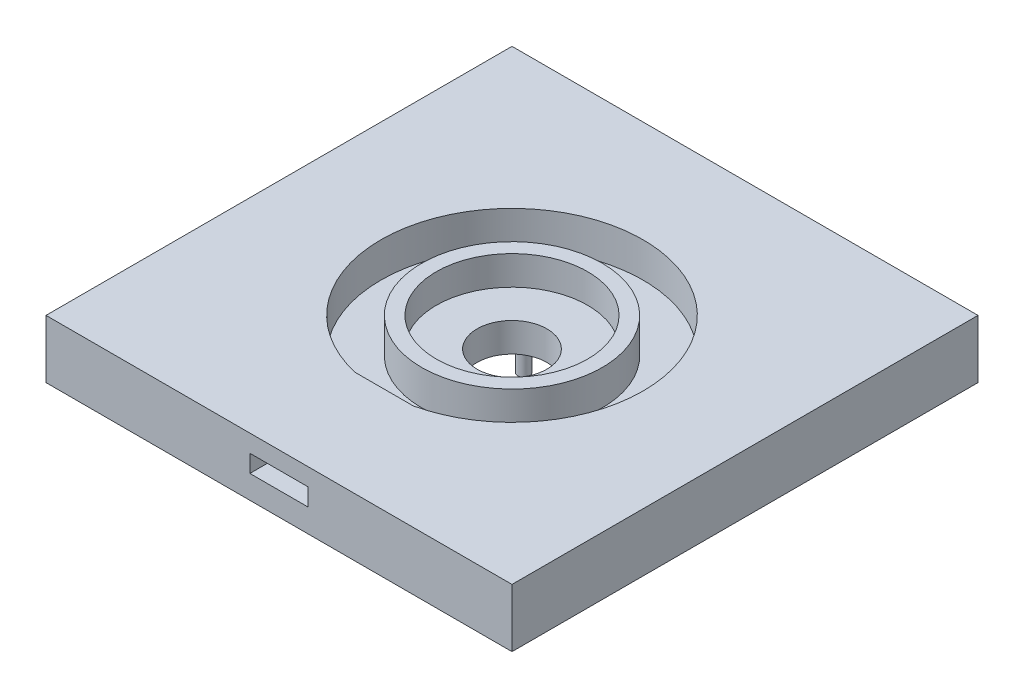
ISO-10303-21;
HEADER;
FILE_DESCRIPTION(('STEP AP214'),'2;1');
FILE_NAME('part.step','',(''),(''),'','','');
FILE_SCHEMA(('AUTOMOTIVE_DESIGN { 1 0 10303 214 1 1 1 1 }'));
ENDSEC;
DATA;
#1=APPLICATION_CONTEXT('core data for automotive mechanical design processes');
#2=APPLICATION_PROTOCOL_DEFINITION('international standard','automotive_design',2000,#1);
#3=PRODUCT_CONTEXT('',#1,'mechanical');
#4=PRODUCT('Part','Part','',(#3));
#5=PRODUCT_RELATED_PRODUCT_CATEGORY('part','',(#4));
#6=PRODUCT_DEFINITION_FORMATION('','',#4);
#7=PRODUCT_DEFINITION_CONTEXT('part definition',#1,'design');
#8=PRODUCT_DEFINITION('design','',#6,#7);
#9=PRODUCT_DEFINITION_SHAPE('','',#8);
#10=(LENGTH_UNIT() NAMED_UNIT(*) SI_UNIT(.MILLI.,.METRE.));
#11=(NAMED_UNIT(*) PLANE_ANGLE_UNIT() SI_UNIT($,.RADIAN.));
#12=(NAMED_UNIT(*) SI_UNIT($,.STERADIAN.) SOLID_ANGLE_UNIT());
#13=UNCERTAINTY_MEASURE_WITH_UNIT(LENGTH_MEASURE(1.E-05),#10,'distance_accuracy_value','');
#14=(GEOMETRIC_REPRESENTATION_CONTEXT(3) GLOBAL_UNCERTAINTY_ASSIGNED_CONTEXT((#13)) GLOBAL_UNIT_ASSIGNED_CONTEXT((#10,
#11,#12)) REPRESENTATION_CONTEXT('',''));
#15=CARTESIAN_POINT('',(0.,0.,0.));
#16=DIRECTION('',(0.,0.,1.));
#17=DIRECTION('',(1.,0.,0.));
#18=AXIS2_PLACEMENT_3D('',#15,#16,#17);
#19=CARTESIAN_POINT('',(6.94458541445559,4.,0.));
#20=DIRECTION('',(-1.,0.,0.));
#21=DIRECTION('',(0.,0.,1.));
#22=AXIS2_PLACEMENT_3D('',#19,#20,#21);
#23=PLANE('',#22);
#24=DIRECTION('',(0.,1.,0.));
#25=VECTOR('',#24,1.);
#26=CARTESIAN_POINT('',(6.94458541445556,4.,35.7587169268071));
#27=LINE('',#26,#25);
#28=CARTESIAN_POINT('',(6.94458541445556,4.,35.7587169268071));
#29=VERTEX_POINT('',#28);
#30=CARTESIAN_POINT('',(6.94458541445556,7.,35.7587169268071));
#31=VERTEX_POINT('',#30);
#32=EDGE_CURVE('E141',#29,#31,#27,.T.);
#33=ORIENTED_EDGE('',*,*,#32,.T.);
#34=DIRECTION('',(0.,0.,-1.));
#35=VECTOR('',#34,1.);
#36=CARTESIAN_POINT('',(6.94458541445559,7.,0.));
#37=LINE('',#36,#35);
#38=CARTESIAN_POINT('',(6.94458541445557,7.,17.6961278952874));
#39=VERTEX_POINT('',#38);
#40=EDGE_CURVE('E121',#31,#39,#37,.T.);
#41=ORIENTED_EDGE('',*,*,#40,.T.);
#42=DIRECTION('',(0.,1.,0.));
#43=VECTOR('',#42,1.);
#44=CARTESIAN_POINT('',(6.94458541445557,4.,17.6961278952874));
#45=LINE('',#44,#43);
#46=CARTESIAN_POINT('',(6.94458541445557,4.,17.6961278952874));
#47=VERTEX_POINT('',#46);
#48=EDGE_CURVE('E145',#47,#39,#45,.T.);
#49=ORIENTED_EDGE('',*,*,#48,.F.);
#50=DIRECTION('',(0.,0.,1.));
#51=VECTOR('',#50,1.);
#52=CARTESIAN_POINT('',(6.94458541445559,4.,0.));
#53=LINE('',#52,#51);
#54=EDGE_CURVE('E48',#47,#29,#53,.T.);
#55=ORIENTED_EDGE('',*,*,#54,.T.);
#56=EDGE_LOOP('',(#33,#41,#49,#55));
#57=FACE_BOUND('',#56,.T.);
#58=ADVANCED_FACE('F33',(#57),#23,.T.);
#59=CARTESIAN_POINT('',(-3.05541458554445,4.,0.));
#60=DIRECTION('',(1.,0.,0.));
#61=DIRECTION('',(0.,0.,-1.));
#62=AXIS2_PLACEMENT_3D('',#59,#60,#61);
#63=PLANE('',#62);
#64=DIRECTION('',(0.,1.,0.));
#65=VECTOR('',#64,1.);
#66=CARTESIAN_POINT('',(-3.05541458554445,4.,17.6961278952874));
#67=LINE('',#66,#65);
#68=CARTESIAN_POINT('',(-3.05541458554445,4.,17.6961278952874));
#69=VERTEX_POINT('',#68);
#70=CARTESIAN_POINT('',(-3.05541458554445,7.,17.6961278952874));
#71=VERTEX_POINT('',#70);
#72=EDGE_CURVE('E135',#69,#71,#67,.T.);
#73=ORIENTED_EDGE('',*,*,#72,.T.);
#74=DIRECTION('',(0.,0.,-1.));
#75=VECTOR('',#74,1.);
#76=CARTESIAN_POINT('',(-3.05541458554445,7.,35.7587169268071));
#77=LINE('',#76,#75);
#78=CARTESIAN_POINT('',(-3.05541458554445,7.,35.7587169268071));
#79=VERTEX_POINT('',#78);
#80=EDGE_CURVE('E118',#79,#71,#77,.T.);
#81=ORIENTED_EDGE('',*,*,#80,.F.);
#82=DIRECTION('',(0.,1.,0.));
#83=VECTOR('',#82,1.);
#84=CARTESIAN_POINT('',(-3.05541458554445,4.,35.7587169268071));
#85=LINE('',#84,#83);
#86=CARTESIAN_POINT('',(-3.05541458554445,4.,35.7587169268071));
#87=VERTEX_POINT('',#86);
#88=EDGE_CURVE('E132',#87,#79,#85,.T.);
#89=ORIENTED_EDGE('',*,*,#88,.F.);
#90=DIRECTION('',(0.,0.,-1.));
#91=VECTOR('',#90,1.);
#92=CARTESIAN_POINT('',(-3.05541458554445,4.,0.));
#93=LINE('',#92,#91);
#94=EDGE_CURVE('E474',#87,#69,#93,.T.);
#95=ORIENTED_EDGE('',*,*,#94,.T.);
#96=EDGE_LOOP('',(#73,#81,#89,#95));
#97=FACE_BOUND('',#96,.T.);
#98=ADVANCED_FACE('F131',(#97),#63,.T.);
#99=CARTESIAN_POINT('',(-38.0554145855444,10.,35.7587169268071));
#100=DIRECTION('',(0.,0.,-1.));
#101=DIRECTION('',(-1.,0.,0.));
#102=AXIS2_PLACEMENT_3D('',#99,#100,#101);
#103=PLANE('',#102);
#104=DIRECTION('',(0.,-1.,0.));
#105=VECTOR('',#104,1.);
#106=CARTESIAN_POINT('',(41.9445854144556,10.,35.7587169268071));
#107=LINE('',#106,#105);
#108=CARTESIAN_POINT('',(41.9445854144556,10.,35.7587169268071));
#109=VERTEX_POINT('',#108);
#110=CARTESIAN_POINT('',(41.9445854144556,0.,35.7587169268071));
#111=VERTEX_POINT('',#110);
#112=EDGE_CURVE('E41',#109,#111,#107,.T.);
#113=ORIENTED_EDGE('',*,*,#112,.F.);
#114=DIRECTION('',(1.,0.,0.));
#115=VECTOR('',#114,1.);
#116=CARTESIAN_POINT('',(-38.0554145855444,10.,35.7587169268071));
#117=LINE('',#116,#115);
#118=CARTESIAN_POINT('',(-38.0554145855444,10.,35.7587169268071));
#119=VERTEX_POINT('',#118);
#120=EDGE_CURVE('E85',#119,#109,#117,.T.);
#121=ORIENTED_EDGE('',*,*,#120,.F.);
#122=DIRECTION('',(0.,-1.,0.));
#123=VECTOR('',#122,1.);
#124=CARTESIAN_POINT('',(-38.0554145855444,10.,35.7587169268071));
#125=LINE('',#124,#123);
#126=CARTESIAN_POINT('',(-38.0554145855444,0.,35.7587169268071));
#127=VERTEX_POINT('',#126);
#128=EDGE_CURVE('E11',#119,#127,#125,.T.);
#129=ORIENTED_EDGE('',*,*,#128,.T.);
#130=DIRECTION('',(1.,0.,0.));
#131=VECTOR('',#130,1.);
#132=CARTESIAN_POINT('',(-38.0554145855444,0.,35.7587169268071));
#133=LINE('',#132,#131);
#134=EDGE_CURVE('E207',#127,#111,#133,.T.);
#135=ORIENTED_EDGE('',*,*,#134,.T.);
#136=EDGE_LOOP('',(#113,#121,#129,#135));
#137=FACE_BOUND('',#136,.T.);
#138=DIRECTION('',(-1.,0.,0.));
#139=VECTOR('',#138,1.);
#140=CARTESIAN_POINT('',(9.94458541445556,7.,35.7587169268071));
#141=LINE('',#140,#139);
#142=EDGE_CURVE('E114',#31,#79,#141,.T.);
#143=ORIENTED_EDGE('',*,*,#142,.F.);
#144=ORIENTED_EDGE('',*,*,#32,.F.);
#145=DIRECTION('',(1.,0.,0.));
#146=VECTOR('',#145,1.);
#147=CARTESIAN_POINT('',(0.,4.,35.7587169268071));
#148=LINE('',#147,#146);
#149=EDGE_CURVE('E140',#87,#29,#148,.T.);
#150=ORIENTED_EDGE('',*,*,#149,.F.);
#151=ORIENTED_EDGE('',*,*,#88,.T.);
#152=EDGE_LOOP('',(#143,#144,#150,#151));
#153=FACE_BOUND('',#152,.T.);
#154=ADVANCED_FACE('F139',(#137,#153),#103,.F.);
#155=CARTESIAN_POINT('',(0.,10.,0.));
#156=DIRECTION('',(0.,-1.,0.));
#157=DIRECTION('',(0.,0.,-1.));
#158=AXIS2_PLACEMENT_3D('',#155,#156,#157);
#159=PLANE('',#158);
#160=CARTESIAN_POINT('',(1.94458541445556,10.,-4.24128307319286));
#161=DIRECTION('',(0.,1.,0.));
#162=DIRECTION('',(0.,0.,1.));
#163=AXIS2_PLACEMENT_3D('',#160,#161,#162);
#164=CIRCLE('',#163,22.5);
#165=CARTESIAN_POINT('',(6.94458541445556,10.,17.6961278952874));
#166=VERTEX_POINT('',#165);
#167=CARTESIAN_POINT('',(-3.05541458554445,10.,17.6961278952874));
#168=VERTEX_POINT('',#167);
#169=EDGE_CURVE('E154',#166,#168,#164,.T.);
#170=ORIENTED_EDGE('',*,*,#169,.F.);
#171=DIRECTION('',(-1.,0.,0.));
#172=VECTOR('',#171,1.);
#173=CARTESIAN_POINT('',(9.94458541445556,10.,17.6961278952874));
#174=LINE('',#173,#172);
#175=EDGE_CURVE('E469',#166,#168,#174,.T.);
#176=ORIENTED_EDGE('',*,*,#175,.T.);
#177=EDGE_LOOP('',(#170,#176));
#178=FACE_BOUND('',#177,.T.);
#179=ORIENTED_EDGE('',*,*,#120,.T.);
#180=DIRECTION('',(0.,0.,-1.));
#181=VECTOR('',#180,1.);
#182=CARTESIAN_POINT('',(41.9445854144556,10.,35.7587169268071));
#183=LINE('',#182,#181);
#184=CARTESIAN_POINT('',(41.9445854144556,10.,-44.2412830731929));
#185=VERTEX_POINT('',#184);
#186=EDGE_CURVE('E201',#109,#185,#183,.T.);
#187=ORIENTED_EDGE('',*,*,#186,.T.);
#188=DIRECTION('',(-1.,0.,0.));
#189=VECTOR('',#188,1.);
#190=CARTESIAN_POINT('',(-38.0554145855444,10.,-44.2412830731929));
#191=LINE('',#190,#189);
#192=CARTESIAN_POINT('',(-38.0554145855444,10.,-44.2412830731929));
#193=VERTEX_POINT('',#192);
#194=EDGE_CURVE('E57',#185,#193,#191,.T.);
#195=ORIENTED_EDGE('',*,*,#194,.T.);
#196=DIRECTION('',(0.,0.,1.));
#197=VECTOR('',#196,1.);
#198=CARTESIAN_POINT('',(-38.0554145855444,10.,35.7587169268071));
#199=LINE('',#198,#197);
#200=EDGE_CURVE('E198',#193,#119,#199,.T.);
#201=ORIENTED_EDGE('',*,*,#200,.T.);
#202=EDGE_LOOP('',(#179,#187,#195,#201));
#203=FACE_BOUND('',#202,.T.);
#204=ADVANCED_FACE('F259',(#178,#203),#159,.F.);
#205=CARTESIAN_POINT('',(1.94458541445556,4.,-4.24128307319286));
#206=DIRECTION('',(0.,1.,0.));
#207=DIRECTION('',(0.,0.,1.));
#208=AXIS2_PLACEMENT_3D('',#205,#206,#207);
#209=CYLINDRICAL_SURFACE('',#208,22.5);
#210=ORIENTED_EDGE('',*,*,#48,.T.);
#211=DIRECTION('',(0.,1.,0.));
#212=VECTOR('',#211,1.);
#213=CARTESIAN_POINT('',(6.94458541445557,4.,17.6961278952874));
#214=LINE('',#213,#212);
#215=EDGE_CURVE('E126',#39,#166,#214,.T.);
#216=ORIENTED_EDGE('',*,*,#215,.T.);
#217=ORIENTED_EDGE('',*,*,#169,.T.);
#218=DIRECTION('',(0.,1.,0.));
#219=VECTOR('',#218,1.);
#220=CARTESIAN_POINT('',(-3.05541458554445,7.,17.6961278952874));
#221=LINE('',#220,#219);
#222=EDGE_CURVE('E136',#71,#168,#221,.T.);
#223=ORIENTED_EDGE('',*,*,#222,.F.);
#224=ORIENTED_EDGE('',*,*,#72,.F.);
#225=CARTESIAN_POINT('',(1.94458541445556,4.,-4.24128307319286));
#226=DIRECTION('',(0.,1.,0.));
#227=DIRECTION('',(0.,0.,1.));
#228=AXIS2_PLACEMENT_3D('',#225,#226,#227);
#229=CIRCLE('',#228,22.5);
#230=EDGE_CURVE('E157',#47,#69,#229,.T.);
#231=ORIENTED_EDGE('',*,*,#230,.F.);
#232=EDGE_LOOP('',(#210,#216,#217,#223,#224,#231));
#233=FACE_BOUND('',#232,.T.);
#234=ADVANCED_FACE('F255',(#233),#209,.F.);
#235=CARTESIAN_POINT('',(1.94458541445556,10.,-4.24128307319286));
#236=DIRECTION('',(0.,1.,0.));
#237=DIRECTION('',(0.,0.,1.));
#238=AXIS2_PLACEMENT_3D('',#235,#236,#237);
#239=CIRCLE('',#238,13.);
#240=CARTESIAN_POINT('',(1.94458541445556,10.,8.75871692680714));
#241=VERTEX_POINT('',#240);
#242=EDGE_CURVE('E183',#241,#241,#239,.T.);
#243=ORIENTED_EDGE('',*,*,#242,.F.);
#244=EDGE_LOOP('',(#243));
#245=FACE_BOUND('',#244,.T.);
#246=CARTESIAN_POINT('',(1.94458541445556,10.,-4.24128307319286));
#247=DIRECTION('',(0.,1.,0.));
#248=DIRECTION('',(0.,0.,1.));
#249=AXIS2_PLACEMENT_3D('',#246,#247,#248);
#250=CIRCLE('',#249,15.5);
#251=CARTESIAN_POINT('',(1.94458541445556,10.,11.2587169268071));
#252=VERTEX_POINT('',#251);
#253=EDGE_CURVE('E143',#252,#252,#250,.T.);
#254=ORIENTED_EDGE('',*,*,#253,.T.);
#255=EDGE_LOOP('',(#254));
#256=FACE_BOUND('',#255,.T.);
#257=ADVANCED_FACE('F258',(#245,#256),#159,.F.);
#258=CARTESIAN_POINT('',(-38.0554145855444,10.,35.7587169268071));
#259=DIRECTION('',(1.,0.,0.));
#260=DIRECTION('',(0.,0.,-1.));
#261=AXIS2_PLACEMENT_3D('',#258,#259,#260);
#262=PLANE('',#261);
#263=DIRECTION('',(0.,0.,1.));
#264=VECTOR('',#263,1.);
#265=CARTESIAN_POINT('',(-38.0554145855444,0.,35.7587169268071));
#266=LINE('',#265,#264);
#267=CARTESIAN_POINT('',(-38.0554145855444,0.,-44.2412830731929));
#268=VERTEX_POINT('',#267);
#269=EDGE_CURVE('E197',#268,#127,#266,.T.);
#270=ORIENTED_EDGE('',*,*,#269,.T.);
#271=ORIENTED_EDGE('',*,*,#128,.F.);
#272=ORIENTED_EDGE('',*,*,#200,.F.);
#273=DIRECTION('',(0.,-1.,0.));
#274=VECTOR('',#273,1.);
#275=CARTESIAN_POINT('',(-38.0554145855444,10.,-44.2412830731929));
#276=LINE('',#275,#274);
#277=EDGE_CURVE('E204',#193,#268,#276,.T.);
#278=ORIENTED_EDGE('',*,*,#277,.T.);
#279=EDGE_LOOP('',(#270,#271,#272,#278));
#280=FACE_BOUND('',#279,.T.);
#281=ADVANCED_FACE('F35',(#280),#262,.F.);
#282=CARTESIAN_POINT('',(41.9445854144556,10.,35.7587169268071));
#283=DIRECTION('',(-1.,0.,0.));
#284=DIRECTION('',(0.,0.,1.));
#285=AXIS2_PLACEMENT_3D('',#282,#283,#284);
#286=PLANE('',#285);
#287=DIRECTION('',(0.,0.,-1.));
#288=VECTOR('',#287,1.);
#289=CARTESIAN_POINT('',(41.9445854144556,0.,35.7587169268071));
#290=LINE('',#289,#288);
#291=CARTESIAN_POINT('',(41.9445854144556,0.,-44.2412830731929));
#292=VERTEX_POINT('',#291);
#293=EDGE_CURVE('E209',#111,#292,#290,.T.);
#294=ORIENTED_EDGE('',*,*,#293,.T.);
#295=DIRECTION('',(0.,-1.,0.));
#296=VECTOR('',#295,1.);
#297=CARTESIAN_POINT('',(41.9445854144556,10.,-44.2412830731929));
#298=LINE('',#297,#296);
#299=EDGE_CURVE('E213',#185,#292,#298,.T.);
#300=ORIENTED_EDGE('',*,*,#299,.F.);
#301=ORIENTED_EDGE('',*,*,#186,.F.);
#302=ORIENTED_EDGE('',*,*,#112,.T.);
#303=EDGE_LOOP('',(#294,#300,#301,#302));
#304=FACE_BOUND('',#303,.T.);
#305=ADVANCED_FACE('F218',(#304),#286,.F.);
#306=CARTESIAN_POINT('',(-38.0554145855444,10.,-44.2412830731929));
#307=DIRECTION('',(0.,0.,1.));
#308=DIRECTION('',(1.,0.,0.));
#309=AXIS2_PLACEMENT_3D('',#306,#307,#308);
#310=PLANE('',#309);
#311=DIRECTION('',(-1.,0.,0.));
#312=VECTOR('',#311,1.);
#313=CARTESIAN_POINT('',(-38.0554145855444,0.,-44.2412830731929));
#314=LINE('',#313,#312);
#315=EDGE_CURVE('E78',#292,#268,#314,.T.);
#316=ORIENTED_EDGE('',*,*,#315,.T.);
#317=ORIENTED_EDGE('',*,*,#277,.F.);
#318=ORIENTED_EDGE('',*,*,#194,.F.);
#319=ORIENTED_EDGE('',*,*,#299,.T.);
#320=EDGE_LOOP('',(#316,#317,#318,#319));
#321=FACE_BOUND('',#320,.T.);
#322=ADVANCED_FACE('F226',(#321),#310,.F.);
#323=CARTESIAN_POINT('',(0.,0.,0.));
#324=DIRECTION('',(0.,-1.,0.));
#325=DIRECTION('',(0.,0.,-1.));
#326=AXIS2_PLACEMENT_3D('',#323,#324,#325);
#327=PLANE('',#326);
#328=CARTESIAN_POINT('',(-8.55541458554444,0.,-4.24128307319286));
#329=DIRECTION('',(0.,-1.,0.));
#330=DIRECTION('',(0.,0.,1.));
#331=AXIS2_PLACEMENT_3D('',#328,#329,#330);
#332=CIRCLE('',#331,1.);
#333=CARTESIAN_POINT('',(-8.55541458554444,0.,-3.24128307319286));
#334=VERTEX_POINT('',#333);
#335=EDGE_CURVE('E159',#334,#334,#332,.T.);
#336=ORIENTED_EDGE('',*,*,#335,.F.);
#337=EDGE_LOOP('',(#336));
#338=FACE_BOUND('',#337,.T.);
#339=CARTESIAN_POINT('',(-8.55541458554444,0.,-16.7412830731929));
#340=DIRECTION('',(0.,-1.,0.));
#341=DIRECTION('',(0.,0.,1.));
#342=AXIS2_PLACEMENT_3D('',#339,#340,#341);
#343=CIRCLE('',#342,1.);
#344=CARTESIAN_POINT('',(-8.55541458554444,0.,-15.7412830731929));
#345=VERTEX_POINT('',#344);
#346=EDGE_CURVE('E165',#345,#345,#343,.T.);
#347=ORIENTED_EDGE('',*,*,#346,.F.);
#348=EDGE_LOOP('',(#347));
#349=FACE_BOUND('',#348,.T.);
#350=CARTESIAN_POINT('',(12.4445854144556,0.,-4.24128307319286));
#351=DIRECTION('',(0.,-1.,0.));
#352=DIRECTION('',(0.,0.,-1.));
#353=AXIS2_PLACEMENT_3D('',#350,#351,#352);
#354=CIRCLE('',#353,1.);
#355=CARTESIAN_POINT('',(12.4445854144556,0.,-5.24128307319286));
#356=VERTEX_POINT('',#355);
#357=EDGE_CURVE('E171',#356,#356,#354,.T.);
#358=ORIENTED_EDGE('',*,*,#357,.F.);
#359=EDGE_LOOP('',(#358));
#360=FACE_BOUND('',#359,.T.);
#361=CARTESIAN_POINT('',(12.4445854144556,0.,-16.7412830731929));
#362=DIRECTION('',(0.,-1.,0.));
#363=DIRECTION('',(0.,0.,-1.));
#364=AXIS2_PLACEMENT_3D('',#361,#362,#363);
#365=CIRCLE('',#364,1.);
#366=CARTESIAN_POINT('',(12.4445854144556,0.,-17.7412830731929));
#367=VERTEX_POINT('',#366);
#368=EDGE_CURVE('E177',#367,#367,#365,.T.);
#369=ORIENTED_EDGE('',*,*,#368,.F.);
#370=EDGE_LOOP('',(#369));
#371=FACE_BOUND('',#370,.T.);
#372=CARTESIAN_POINT('',(1.94458541445556,0.,-4.24128307319286));
#373=DIRECTION('',(0.,1.,0.));
#374=DIRECTION('',(0.,0.,1.));
#375=AXIS2_PLACEMENT_3D('',#372,#373,#374);
#376=CIRCLE('',#375,6.);
#377=CARTESIAN_POINT('',(1.94458541445556,0.,1.75871692680714));
#378=VERTEX_POINT('',#377);
#379=EDGE_CURVE('E194',#378,#378,#376,.T.);
#380=ORIENTED_EDGE('',*,*,#379,.T.);
#381=EDGE_LOOP('',(#380));
#382=FACE_BOUND('',#381,.T.);
#383=ORIENTED_EDGE('',*,*,#269,.F.);
#384=ORIENTED_EDGE('',*,*,#315,.F.);
#385=ORIENTED_EDGE('',*,*,#293,.F.);
#386=ORIENTED_EDGE('',*,*,#134,.F.);
#387=EDGE_LOOP('',(#383,#384,#385,#386));
#388=FACE_BOUND('',#387,.T.);
#389=ADVANCED_FACE('F222',(#338,#349,#360,#371,#382,#388),#327,.T.);
#390=CARTESIAN_POINT('',(1.94458541445556,10.,-4.24128307319286));
#391=DIRECTION('',(0.,1.,0.));
#392=DIRECTION('',(0.,0.,1.));
#393=AXIS2_PLACEMENT_3D('',#390,#391,#392);
#394=CYLINDRICAL_SURFACE('',#393,6.);
#395=ORIENTED_EDGE('',*,*,#379,.F.);
#396=EDGE_LOOP('',(#395));
#397=FACE_BOUND('',#396,.T.);
#398=CARTESIAN_POINT('',(1.94458541445556,5.,-4.24128307319286));
#399=DIRECTION('',(0.,1.,0.));
#400=DIRECTION('',(0.,0.,1.));
#401=AXIS2_PLACEMENT_3D('',#398,#399,#400);
#402=CIRCLE('',#401,6.);
#403=CARTESIAN_POINT('',(1.94458541445556,5.,1.75871692680714));
#404=VERTEX_POINT('',#403);
#405=EDGE_CURVE('E191',#404,#404,#402,.T.);
#406=ORIENTED_EDGE('',*,*,#405,.T.);
#407=EDGE_LOOP('',(#406));
#408=FACE_BOUND('',#407,.T.);
#409=ADVANCED_FACE('F233',(#397,#408),#394,.F.);
#410=CARTESIAN_POINT('',(7.94458541445556,5.,-4.24128307319286));
#411=DIRECTION('',(0.,-1.,0.));
#412=DIRECTION('',(0.,0.,-1.));
#413=AXIS2_PLACEMENT_3D('',#410,#411,#412);
#414=PLANE('',#413);
#415=ORIENTED_EDGE('',*,*,#405,.F.);
#416=EDGE_LOOP('',(#415));
#417=FACE_BOUND('',#416,.T.);
#418=CARTESIAN_POINT('',(1.94458541445556,5.,-4.24128307319286));
#419=DIRECTION('',(0.,1.,0.));
#420=DIRECTION('',(0.,0.,1.));
#421=AXIS2_PLACEMENT_3D('',#418,#419,#420);
#422=CIRCLE('',#421,13.);
#423=CARTESIAN_POINT('',(1.94458541445556,5.,8.75871692680714));
#424=VERTEX_POINT('',#423);
#425=EDGE_CURVE('E188',#424,#424,#422,.T.);
#426=ORIENTED_EDGE('',*,*,#425,.T.);
#427=EDGE_LOOP('',(#426));
#428=FACE_BOUND('',#427,.T.);
#429=ADVANCED_FACE('F295',(#417,#428),#414,.F.);
#430=CARTESIAN_POINT('',(1.94458541445556,10.,-4.24128307319286));
#431=DIRECTION('',(0.,1.,0.));
#432=DIRECTION('',(0.,0.,1.));
#433=AXIS2_PLACEMENT_3D('',#430,#431,#432);
#434=CYLINDRICAL_SURFACE('',#433,13.);
#435=ORIENTED_EDGE('',*,*,#425,.F.);
#436=EDGE_LOOP('',(#435));
#437=FACE_BOUND('',#436,.T.);
#438=ORIENTED_EDGE('',*,*,#242,.T.);
#439=EDGE_LOOP('',(#438));
#440=FACE_BOUND('',#439,.T.);
#441=ADVANCED_FACE('F291',(#437,#440),#434,.F.);
#442=CARTESIAN_POINT('',(12.4445854144556,-10.,-16.7412830731929));
#443=DIRECTION('',(0.,1.,0.));
#444=DIRECTION('',(0.,0.,1.));
#445=AXIS2_PLACEMENT_3D('',#442,#443,#444);
#446=CYLINDRICAL_SURFACE('',#445,1.);
#447=CARTESIAN_POINT('',(12.4445854144556,-10.,-16.7412830731929));
#448=DIRECTION('',(0.,-1.,0.));
#449=DIRECTION('',(0.,0.,-1.));
#450=AXIS2_PLACEMENT_3D('',#447,#448,#449);
#451=CIRCLE('',#450,1.);
#452=CARTESIAN_POINT('',(12.4445854144556,-10.,-17.7412830731929));
#453=VERTEX_POINT('',#452);
#454=EDGE_CURVE('E180',#453,#453,#451,.T.);
#455=ORIENTED_EDGE('',*,*,#454,.F.);
#456=EDGE_LOOP('',(#455));
#457=FACE_BOUND('',#456,.T.);
#458=ORIENTED_EDGE('',*,*,#368,.T.);
#459=EDGE_LOOP('',(#458));
#460=FACE_BOUND('',#459,.T.);
#461=ADVANCED_FACE('F287',(#457,#460),#446,.T.);
#462=CARTESIAN_POINT('',(12.4445854144556,-10.,-16.7412830731929));
#463=DIRECTION('',(0.,-1.,0.));
#464=DIRECTION('',(0.,0.,-1.));
#465=AXIS2_PLACEMENT_3D('',#462,#463,#464);
#466=PLANE('',#465);
#467=ORIENTED_EDGE('',*,*,#454,.T.);
#468=EDGE_LOOP('',(#467));
#469=FACE_BOUND('',#468,.T.);
#470=ADVANCED_FACE('F283',(#469),#466,.T.);
#471=CARTESIAN_POINT('',(12.4445854144556,-10.,-4.24128307319286));
#472=DIRECTION('',(0.,1.,0.));
#473=DIRECTION('',(0.,0.,1.));
#474=AXIS2_PLACEMENT_3D('',#471,#472,#473);
#475=CYLINDRICAL_SURFACE('',#474,1.);
#476=CARTESIAN_POINT('',(12.4445854144556,-10.,-4.24128307319286));
#477=DIRECTION('',(0.,-1.,0.));
#478=DIRECTION('',(0.,0.,-1.));
#479=AXIS2_PLACEMENT_3D('',#476,#477,#478);
#480=CIRCLE('',#479,1.);
#481=CARTESIAN_POINT('',(12.4445854144556,-10.,-5.24128307319286));
#482=VERTEX_POINT('',#481);
#483=EDGE_CURVE('E174',#482,#482,#480,.T.);
#484=ORIENTED_EDGE('',*,*,#483,.F.);
#485=EDGE_LOOP('',(#484));
#486=FACE_BOUND('',#485,.T.);
#487=ORIENTED_EDGE('',*,*,#357,.T.);
#488=EDGE_LOOP('',(#487));
#489=FACE_BOUND('',#488,.T.);
#490=ADVANCED_FACE('F279',(#486,#489),#475,.T.);
#491=CARTESIAN_POINT('',(12.4445854144556,-10.,-4.24128307319286));
#492=DIRECTION('',(0.,-1.,0.));
#493=DIRECTION('',(0.,0.,-1.));
#494=AXIS2_PLACEMENT_3D('',#491,#492,#493);
#495=PLANE('',#494);
#496=ORIENTED_EDGE('',*,*,#483,.T.);
#497=EDGE_LOOP('',(#496));
#498=FACE_BOUND('',#497,.T.);
#499=ADVANCED_FACE('F275',(#498),#495,.T.);
#500=CARTESIAN_POINT('',(-8.55541458554444,-10.,-16.7412830731929));
#501=DIRECTION('',(0.,1.,0.));
#502=DIRECTION('',(0.,0.,1.));
#503=AXIS2_PLACEMENT_3D('',#500,#501,#502);
#504=CYLINDRICAL_SURFACE('',#503,1.);
#505=CARTESIAN_POINT('',(-8.55541458554444,-10.,-16.7412830731929));
#506=DIRECTION('',(0.,-1.,0.));
#507=DIRECTION('',(0.,0.,1.));
#508=AXIS2_PLACEMENT_3D('',#505,#506,#507);
#509=CIRCLE('',#508,1.);
#510=CARTESIAN_POINT('',(-8.55541458554444,-10.,-15.7412830731929));
#511=VERTEX_POINT('',#510);
#512=EDGE_CURVE('E168',#511,#511,#509,.T.);
#513=ORIENTED_EDGE('',*,*,#512,.F.);
#514=EDGE_LOOP('',(#513));
#515=FACE_BOUND('',#514,.T.);
#516=ORIENTED_EDGE('',*,*,#346,.T.);
#517=EDGE_LOOP('',(#516));
#518=FACE_BOUND('',#517,.T.);
#519=ADVANCED_FACE('F271',(#515,#518),#504,.T.);
#520=CARTESIAN_POINT('',(-8.55541458554444,-10.,-16.7412830731929));
#521=DIRECTION('',(0.,1.,0.));
#522=DIRECTION('',(0.,0.,1.));
#523=AXIS2_PLACEMENT_3D('',#520,#521,#522);
#524=PLANE('',#523);
#525=ORIENTED_EDGE('',*,*,#512,.T.);
#526=EDGE_LOOP('',(#525));
#527=FACE_BOUND('',#526,.T.);
#528=ADVANCED_FACE('F267',(#527),#524,.F.);
#529=CARTESIAN_POINT('',(-8.55541458554444,-10.,-4.24128307319286));
#530=DIRECTION('',(0.,1.,0.));
#531=DIRECTION('',(0.,0.,1.));
#532=AXIS2_PLACEMENT_3D('',#529,#530,#531);
#533=CYLINDRICAL_SURFACE('',#532,1.);
#534=CARTESIAN_POINT('',(-8.55541458554444,-10.,-4.24128307319286));
#535=DIRECTION('',(0.,-1.,0.));
#536=DIRECTION('',(0.,0.,1.));
#537=AXIS2_PLACEMENT_3D('',#534,#535,#536);
#538=CIRCLE('',#537,1.);
#539=CARTESIAN_POINT('',(-8.55541458554444,-10.,-3.24128307319286));
#540=VERTEX_POINT('',#539);
#541=EDGE_CURVE('E162',#540,#540,#538,.T.);
#542=ORIENTED_EDGE('',*,*,#541,.F.);
#543=EDGE_LOOP('',(#542));
#544=FACE_BOUND('',#543,.T.);
#545=ORIENTED_EDGE('',*,*,#335,.T.);
#546=EDGE_LOOP('',(#545));
#547=FACE_BOUND('',#546,.T.);
#548=ADVANCED_FACE('F263',(#544,#547),#533,.T.);
#549=CARTESIAN_POINT('',(-8.55541458554444,-10.,-4.24128307319286));
#550=DIRECTION('',(0.,1.,0.));
#551=DIRECTION('',(0.,0.,1.));
#552=AXIS2_PLACEMENT_3D('',#549,#550,#551);
#553=PLANE('',#552);
#554=ORIENTED_EDGE('',*,*,#541,.T.);
#555=EDGE_LOOP('',(#554));
#556=FACE_BOUND('',#555,.T.);
#557=ADVANCED_FACE('F253',(#556),#553,.F.);
#558=CARTESIAN_POINT('',(1.94458541445556,4.,-4.24128307319286));
#559=DIRECTION('',(0.,1.,0.));
#560=DIRECTION('',(0.,0.,1.));
#561=AXIS2_PLACEMENT_3D('',#558,#559,#560);
#562=PLANE('',#561);
#563=CARTESIAN_POINT('',(1.94458541445556,4.,-4.24128307319286));
#564=DIRECTION('',(0.,1.,0.));
#565=DIRECTION('',(0.,0.,1.));
#566=AXIS2_PLACEMENT_3D('',#563,#564,#565);
#567=CIRCLE('',#566,15.5);
#568=CARTESIAN_POINT('',(1.94458541445556,4.,11.2587169268071));
#569=VERTEX_POINT('',#568);
#570=EDGE_CURVE('E151',#569,#569,#567,.T.);
#571=ORIENTED_EDGE('',*,*,#570,.F.);
#572=EDGE_LOOP('',(#571));
#573=FACE_BOUND('',#572,.T.);
#574=ORIENTED_EDGE('',*,*,#230,.T.);
#575=ORIENTED_EDGE('',*,*,#94,.F.);
#576=ORIENTED_EDGE('',*,*,#149,.T.);
#577=ORIENTED_EDGE('',*,*,#54,.F.);
#578=EDGE_LOOP('',(#574,#575,#576,#577));
#579=FACE_BOUND('',#578,.T.);
#580=ADVANCED_FACE('F249',(#573,#579),#562,.T.);
#581=CARTESIAN_POINT('',(1.94458541445556,4.,-4.24128307319286));
#582=DIRECTION('',(0.,1.,0.));
#583=DIRECTION('',(0.,0.,1.));
#584=AXIS2_PLACEMENT_3D('',#581,#582,#583);
#585=CYLINDRICAL_SURFACE('',#584,15.5);
#586=ORIENTED_EDGE('',*,*,#570,.T.);
#587=EDGE_LOOP('',(#586));
#588=FACE_BOUND('',#587,.T.);
#589=ORIENTED_EDGE('',*,*,#253,.F.);
#590=EDGE_LOOP('',(#589));
#591=FACE_BOUND('',#590,.T.);
#592=ADVANCED_FACE('F246',(#588,#591),#585,.T.);
#593=CARTESIAN_POINT('',(9.94458541445556,7.,35.7587169268071));
#594=DIRECTION('',(0.,1.,0.));
#595=DIRECTION('',(0.,0.,1.));
#596=AXIS2_PLACEMENT_3D('',#593,#594,#595);
#597=PLANE('',#596);
#598=ORIENTED_EDGE('',*,*,#40,.F.);
#599=ORIENTED_EDGE('',*,*,#142,.T.);
#600=ORIENTED_EDGE('',*,*,#80,.T.);
#601=DIRECTION('',(-1.,0.,0.));
#602=VECTOR('',#601,1.);
#603=CARTESIAN_POINT('',(9.94458541445556,7.,17.6961278952874));
#604=LINE('',#603,#602);
#605=EDGE_CURVE('E127',#39,#71,#604,.T.);
#606=ORIENTED_EDGE('',*,*,#605,.F.);
#607=EDGE_LOOP('',(#598,#599,#600,#606));
#608=FACE_BOUND('',#607,.T.);
#609=ADVANCED_FACE('F116',(#608),#597,.F.);
#610=CARTESIAN_POINT('',(9.94458541445556,7.,17.6961278952874));
#611=DIRECTION('',(0.,0.,1.));
#612=DIRECTION('',(1.,0.,0.));
#613=AXIS2_PLACEMENT_3D('',#610,#611,#612);
#614=PLANE('',#613);
#615=ORIENTED_EDGE('',*,*,#215,.F.);
#616=ORIENTED_EDGE('',*,*,#605,.T.);
#617=ORIENTED_EDGE('',*,*,#222,.T.);
#618=ORIENTED_EDGE('',*,*,#175,.F.);
#619=EDGE_LOOP('',(#615,#616,#617,#618));
#620=FACE_BOUND('',#619,.T.);
#621=ADVANCED_FACE('F455',(#620),#614,.F.);
#622=CLOSED_SHELL('',(#58,#98,#154,#204,#234,#257,#281,#305,#322,#389,#409,#429,#441,#461,#470,
#490,#499,#519,#528,#548,#557,#580,#592,#609,#621));
#623=MANIFOLD_SOLID_BREP('B2',#622);
#624=ADVANCED_BREP_SHAPE_REPRESENTATION('',(#18,#623),#14);
#625=SHAPE_DEFINITION_REPRESENTATION(#9,#624);
ENDSEC;
END-ISO-10303-21;
